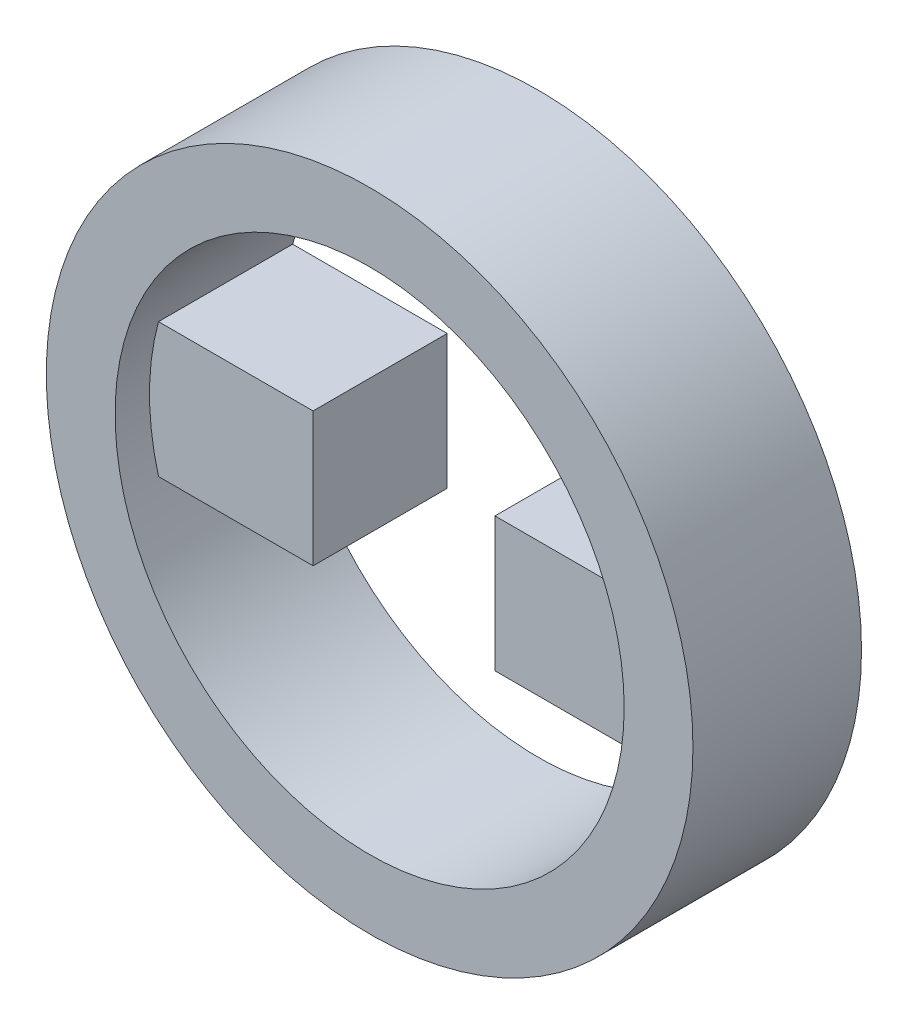
ISO-10303-21;
HEADER;
FILE_DESCRIPTION(('STEP AP214'),'2;1');
FILE_NAME('part.step','',(''),(''),'','','');
FILE_SCHEMA(('AUTOMOTIVE_DESIGN { 1 0 10303 214 1 1 1 1 }'));
ENDSEC;
DATA;
#1=APPLICATION_CONTEXT('core data for automotive mechanical design processes');
#2=APPLICATION_PROTOCOL_DEFINITION('international standard','automotive_design',2000,#1);
#3=PRODUCT_CONTEXT('',#1,'mechanical');
#4=PRODUCT('Part','Part','',(#3));
#5=PRODUCT_RELATED_PRODUCT_CATEGORY('part','',(#4));
#6=PRODUCT_DEFINITION_FORMATION('','',#4);
#7=PRODUCT_DEFINITION_CONTEXT('part definition',#1,'design');
#8=PRODUCT_DEFINITION('design','',#6,#7);
#9=PRODUCT_DEFINITION_SHAPE('','',#8);
#10=(LENGTH_UNIT() NAMED_UNIT(*) SI_UNIT(.MILLI.,.METRE.));
#11=(NAMED_UNIT(*) PLANE_ANGLE_UNIT() SI_UNIT($,.RADIAN.));
#12=(NAMED_UNIT(*) SI_UNIT($,.STERADIAN.) SOLID_ANGLE_UNIT());
#13=UNCERTAINTY_MEASURE_WITH_UNIT(LENGTH_MEASURE(1.E-05),#10,'distance_accuracy_value','');
#14=(GEOMETRIC_REPRESENTATION_CONTEXT(3) GLOBAL_UNCERTAINTY_ASSIGNED_CONTEXT((#13)) GLOBAL_UNIT_ASSIGNED_CONTEXT((#10,
#11,#12)) REPRESENTATION_CONTEXT('',''));
#15=CARTESIAN_POINT('',(0.,0.,0.));
#16=DIRECTION('',(0.,0.,1.));
#17=DIRECTION('',(1.,0.,0.));
#18=AXIS2_PLACEMENT_3D('',#15,#16,#17);
#19=CARTESIAN_POINT('',(0.,0.,4.9));
#20=DIRECTION('',(0.,0.,-1.));
#21=DIRECTION('',(-1.,0.,0.));
#22=AXIS2_PLACEMENT_3D('',#19,#20,#21);
#23=CYLINDRICAL_SURFACE('',#22,7.4);
#24=CARTESIAN_POINT('',(0.,0.,4.9));
#25=DIRECTION('',(0.,0.,1.));
#26=DIRECTION('',(1.,0.,0.));
#27=AXIS2_PLACEMENT_3D('',#24,#25,#26);
#28=CIRCLE('',#27,7.4);
#29=CARTESIAN_POINT('',(7.4,0.,4.9));
#30=VERTEX_POINT('',#29);
#31=EDGE_CURVE('E169',#30,#30,#28,.T.);
#32=ORIENTED_EDGE('',*,*,#31,.T.);
#33=EDGE_LOOP('',(#32));
#34=FACE_BOUND('',#33,.T.);
#35=CARTESIAN_POINT('',(0.,0.,0.));
#36=DIRECTION('',(0.,0.,1.));
#37=DIRECTION('',(1.,0.,0.));
#38=AXIS2_PLACEMENT_3D('',#35,#36,#37);
#39=CIRCLE('',#38,7.4);
#40=CARTESIAN_POINT('',(7.1384522131902,1.95,0.));
#41=VERTEX_POINT('',#40);
#42=CARTESIAN_POINT('',(-7.1384522131902,1.95,0.));
#43=VERTEX_POINT('',#42);
#44=EDGE_CURVE('E168',#41,#43,#39,.T.);
#45=ORIENTED_EDGE('',*,*,#44,.F.);
#46=DIRECTION('',(0.,0.,-1.));
#47=VECTOR('',#46,1.);
#48=CARTESIAN_POINT('',(7.1384522131902,1.95,4.9));
#49=LINE('',#48,#47);
#50=CARTESIAN_POINT('',(7.1384522131902,1.95,3.9));
#51=VERTEX_POINT('',#50);
#52=EDGE_CURVE('E144',#41,#51,#49,.F.);
#53=ORIENTED_EDGE('',*,*,#52,.T.);
#54=CARTESIAN_POINT('',(0.,0.,3.9));
#55=DIRECTION('',(0.,0.,-1.));
#56=DIRECTION('',(-1.,0.,0.));
#57=AXIS2_PLACEMENT_3D('',#54,#55,#56);
#58=CIRCLE('',#57,7.4);
#59=CARTESIAN_POINT('',(7.1384522131902,-1.95,3.9));
#60=VERTEX_POINT('',#59);
#61=EDGE_CURVE('E12',#51,#60,#58,.T.);
#62=ORIENTED_EDGE('',*,*,#61,.T.);
#63=DIRECTION('',(0.,0.,-1.));
#64=VECTOR('',#63,1.);
#65=CARTESIAN_POINT('',(7.1384522131902,-1.95,4.9));
#66=LINE('',#65,#64);
#67=CARTESIAN_POINT('',(7.1384522131902,-1.95,0.));
#68=VERTEX_POINT('',#67);
#69=EDGE_CURVE('E140',#60,#68,#66,.T.);
#70=ORIENTED_EDGE('',*,*,#69,.T.);
#71=CARTESIAN_POINT('',(-7.1384522131902,-1.95,0.));
#72=VERTEX_POINT('',#71);
#73=EDGE_CURVE('E132',#72,#68,#39,.T.);
#74=ORIENTED_EDGE('',*,*,#73,.F.);
#75=DIRECTION('',(0.,0.,-1.));
#76=VECTOR('',#75,1.);
#77=CARTESIAN_POINT('',(-7.1384522131902,-1.95,4.9));
#78=LINE('',#77,#76);
#79=CARTESIAN_POINT('',(-7.1384522131902,-1.95,3.9));
#80=VERTEX_POINT('',#79);
#81=EDGE_CURVE('E181',#72,#80,#78,.F.);
#82=ORIENTED_EDGE('',*,*,#81,.T.);
#83=CARTESIAN_POINT('',(0.,0.,3.9));
#84=DIRECTION('',(0.,0.,1.));
#85=DIRECTION('',(1.,0.,0.));
#86=AXIS2_PLACEMENT_3D('',#83,#84,#85);
#87=CIRCLE('',#86,7.4);
#88=CARTESIAN_POINT('',(-7.1384522131902,1.95,3.9));
#89=VERTEX_POINT('',#88);
#90=EDGE_CURVE('E177',#89,#80,#87,.T.);
#91=ORIENTED_EDGE('',*,*,#90,.F.);
#92=DIRECTION('',(0.,0.,-1.));
#93=VECTOR('',#92,1.);
#94=CARTESIAN_POINT('',(-7.1384522131902,1.95,4.9));
#95=LINE('',#94,#93);
#96=EDGE_CURVE('E55',#89,#43,#95,.T.);
#97=ORIENTED_EDGE('',*,*,#96,.T.);
#98=EDGE_LOOP('',(#45,#53,#62,#70,#74,#82,#91,#97));
#99=FACE_BOUND('',#98,.T.);
#100=ADVANCED_FACE('F47',(#34,#99),#23,.F.);
#101=CARTESIAN_POINT('',(0.,0.,4.9));
#102=DIRECTION('',(0.,0.,1.));
#103=DIRECTION('',(1.,0.,0.));
#104=AXIS2_PLACEMENT_3D('',#101,#102,#103);
#105=PLANE('',#104);
#106=CARTESIAN_POINT('',(0.,0.,4.9));
#107=DIRECTION('',(0.,0.,1.));
#108=DIRECTION('',(1.,0.,0.));
#109=AXIS2_PLACEMENT_3D('',#106,#107,#108);
#110=CIRCLE('',#109,9.4);
#111=CARTESIAN_POINT('',(9.4,0.,4.9));
#112=VERTEX_POINT('',#111);
#113=EDGE_CURVE('E174',#112,#112,#110,.T.);
#114=ORIENTED_EDGE('',*,*,#113,.T.);
#115=EDGE_LOOP('',(#114));
#116=FACE_BOUND('',#115,.T.);
#117=ORIENTED_EDGE('',*,*,#31,.F.);
#118=EDGE_LOOP('',(#117));
#119=FACE_BOUND('',#118,.T.);
#120=ADVANCED_FACE('F213',(#116,#119),#105,.T.);
#121=CARTESIAN_POINT('',(0.,0.,0.));
#122=DIRECTION('',(0.,0.,1.));
#123=DIRECTION('',(1.,0.,0.));
#124=AXIS2_PLACEMENT_3D('',#121,#122,#123);
#125=PLANE('',#124);
#126=ORIENTED_EDGE('',*,*,#73,.T.);
#127=DIRECTION('',(1.,0.,0.));
#128=VECTOR('',#127,1.);
#129=CARTESIAN_POINT('',(8.14220968810114,-1.95,0.));
#130=LINE('',#129,#128);
#131=CARTESIAN_POINT('',(2.64368483130695,-1.95,0.));
#132=VERTEX_POINT('',#131);
#133=EDGE_CURVE('E121',#132,#68,#130,.T.);
#134=ORIENTED_EDGE('',*,*,#133,.F.);
#135=DIRECTION('',(0.,-1.,0.));
#136=VECTOR('',#135,1.);
#137=CARTESIAN_POINT('',(2.64368483130695,1.95,0.));
#138=LINE('',#137,#136);
#139=CARTESIAN_POINT('',(2.64368483130695,1.95,0.));
#140=VERTEX_POINT('',#139);
#141=EDGE_CURVE('E112',#140,#132,#138,.T.);
#142=ORIENTED_EDGE('',*,*,#141,.F.);
#143=DIRECTION('',(-1.,0.,0.));
#144=VECTOR('',#143,1.);
#145=CARTESIAN_POINT('',(8.14220968810114,1.95,0.));
#146=LINE('',#145,#144);
#147=EDGE_CURVE('E62',#41,#140,#146,.T.);
#148=ORIENTED_EDGE('',*,*,#147,.F.);
#149=ORIENTED_EDGE('',*,*,#44,.T.);
#150=DIRECTION('',(-1.,0.,0.));
#151=VECTOR('',#150,1.);
#152=CARTESIAN_POINT('',(-8.14220968810114,1.95,0.));
#153=LINE('',#152,#151);
#154=CARTESIAN_POINT('',(-2.64368483130695,1.95,0.));
#155=VERTEX_POINT('',#154);
#156=EDGE_CURVE('E159',#155,#43,#153,.T.);
#157=ORIENTED_EDGE('',*,*,#156,.F.);
#158=DIRECTION('',(0.,1.,0.));
#159=VECTOR('',#158,1.);
#160=CARTESIAN_POINT('',(-2.64368483130695,1.95,0.));
#161=LINE('',#160,#159);
#162=CARTESIAN_POINT('',(-2.64368483130695,-1.95,0.));
#163=VERTEX_POINT('',#162);
#164=EDGE_CURVE('E147',#163,#155,#161,.T.);
#165=ORIENTED_EDGE('',*,*,#164,.F.);
#166=DIRECTION('',(1.,0.,0.));
#167=VECTOR('',#166,1.);
#168=CARTESIAN_POINT('',(-8.14220968810114,-1.95,0.));
#169=LINE('',#168,#167);
#170=EDGE_CURVE('E69',#72,#163,#169,.T.);
#171=ORIENTED_EDGE('',*,*,#170,.F.);
#172=EDGE_LOOP('',(#126,#134,#142,#148,#149,#157,#165,#171));
#173=FACE_BOUND('',#172,.T.);
#174=CARTESIAN_POINT('',(0.,0.,0.));
#175=DIRECTION('',(0.,0.,1.));
#176=DIRECTION('',(1.,0.,0.));
#177=AXIS2_PLACEMENT_3D('',#174,#175,#176);
#178=CIRCLE('',#177,9.4);
#179=CARTESIAN_POINT('',(9.4,0.,0.));
#180=VERTEX_POINT('',#179);
#181=EDGE_CURVE('E172',#180,#180,#178,.T.);
#182=ORIENTED_EDGE('',*,*,#181,.F.);
#183=EDGE_LOOP('',(#182));
#184=FACE_BOUND('',#183,.T.);
#185=ADVANCED_FACE('F129',(#173,#184),#125,.F.);
#186=CARTESIAN_POINT('',(0.,0.,4.9));
#187=DIRECTION('',(0.,0.,-1.));
#188=DIRECTION('',(-1.,0.,0.));
#189=AXIS2_PLACEMENT_3D('',#186,#187,#188);
#190=CYLINDRICAL_SURFACE('',#189,9.4);
#191=ORIENTED_EDGE('',*,*,#113,.F.);
#192=EDGE_LOOP('',(#191));
#193=FACE_BOUND('',#192,.T.);
#194=ORIENTED_EDGE('',*,*,#181,.T.);
#195=EDGE_LOOP('',(#194));
#196=FACE_BOUND('',#195,.T.);
#197=ADVANCED_FACE('F49',(#193,#196),#190,.T.);
#198=CARTESIAN_POINT('',(0.,0.,3.9));
#199=DIRECTION('',(0.,0.,1.));
#200=DIRECTION('',(1.,0.,0.));
#201=AXIS2_PLACEMENT_3D('',#198,#199,#200);
#202=PLANE('',#201);
#203=DIRECTION('',(-1.,0.,0.));
#204=VECTOR('',#203,1.);
#205=CARTESIAN_POINT('',(-8.14220968810114,1.95,3.9));
#206=LINE('',#205,#204);
#207=CARTESIAN_POINT('',(-2.64368483130695,1.95,3.9));
#208=VERTEX_POINT('',#207);
#209=EDGE_CURVE('E151',#208,#89,#206,.T.);
#210=ORIENTED_EDGE('',*,*,#209,.T.);
#211=ORIENTED_EDGE('',*,*,#90,.T.);
#212=DIRECTION('',(1.,0.,0.));
#213=VECTOR('',#212,1.);
#214=CARTESIAN_POINT('',(-8.14220968810114,-1.95,3.9));
#215=LINE('',#214,#213);
#216=CARTESIAN_POINT('',(-2.64368483130695,-1.95,3.9));
#217=VERTEX_POINT('',#216);
#218=EDGE_CURVE('E154',#80,#217,#215,.T.);
#219=ORIENTED_EDGE('',*,*,#218,.T.);
#220=DIRECTION('',(0.,1.,0.));
#221=VECTOR('',#220,1.);
#222=CARTESIAN_POINT('',(-2.64368483130695,1.95,3.9));
#223=LINE('',#222,#221);
#224=EDGE_CURVE('E148',#217,#208,#223,.T.);
#225=ORIENTED_EDGE('',*,*,#224,.T.);
#226=EDGE_LOOP('',(#210,#211,#219,#225));
#227=FACE_BOUND('',#226,.T.);
#228=ADVANCED_FACE('F190',(#227),#202,.T.);
#229=CARTESIAN_POINT('',(-2.64368483130695,1.95,3.9));
#230=DIRECTION('',(-1.,0.,0.));
#231=DIRECTION('',(0.,0.,1.));
#232=AXIS2_PLACEMENT_3D('',#229,#230,#231);
#233=PLANE('',#232);
#234=ORIENTED_EDGE('',*,*,#164,.T.);
#235=DIRECTION('',(0.,0.,-1.));
#236=VECTOR('',#235,1.);
#237=CARTESIAN_POINT('',(-2.64368483130695,1.95,3.9));
#238=LINE('',#237,#236);
#239=EDGE_CURVE('E165',#208,#155,#238,.T.);
#240=ORIENTED_EDGE('',*,*,#239,.F.);
#241=ORIENTED_EDGE('',*,*,#224,.F.);
#242=DIRECTION('',(0.,0.,-1.));
#243=VECTOR('',#242,1.);
#244=CARTESIAN_POINT('',(-2.64368483130695,-1.95,3.9));
#245=LINE('',#244,#243);
#246=EDGE_CURVE('E156',#217,#163,#245,.T.);
#247=ORIENTED_EDGE('',*,*,#246,.T.);
#248=EDGE_LOOP('',(#234,#240,#241,#247));
#249=FACE_BOUND('',#248,.T.);
#250=ADVANCED_FACE('F196',(#249),#233,.F.);
#251=CARTESIAN_POINT('',(-8.14220968810114,1.95,3.9));
#252=DIRECTION('',(0.,-1.,0.));
#253=DIRECTION('',(1.,0.,0.));
#254=AXIS2_PLACEMENT_3D('',#251,#252,#253);
#255=PLANE('',#254);
#256=ORIENTED_EDGE('',*,*,#96,.F.);
#257=ORIENTED_EDGE('',*,*,#209,.F.);
#258=ORIENTED_EDGE('',*,*,#239,.T.);
#259=ORIENTED_EDGE('',*,*,#156,.T.);
#260=EDGE_LOOP('',(#256,#257,#258,#259));
#261=FACE_BOUND('',#260,.T.);
#262=ADVANCED_FACE('F188',(#261),#255,.F.);
#263=CARTESIAN_POINT('',(-8.14220968810114,-1.95,3.9));
#264=DIRECTION('',(0.,1.,0.));
#265=DIRECTION('',(-1.,0.,0.));
#266=AXIS2_PLACEMENT_3D('',#263,#264,#265);
#267=PLANE('',#266);
#268=ORIENTED_EDGE('',*,*,#81,.F.);
#269=ORIENTED_EDGE('',*,*,#170,.T.);
#270=ORIENTED_EDGE('',*,*,#246,.F.);
#271=ORIENTED_EDGE('',*,*,#218,.F.);
#272=EDGE_LOOP('',(#268,#269,#270,#271));
#273=FACE_BOUND('',#272,.T.);
#274=ADVANCED_FACE('F198',(#273),#267,.F.);
#275=CARTESIAN_POINT('',(0.,0.,3.9));
#276=DIRECTION('',(0.,0.,-1.));
#277=DIRECTION('',(-1.,0.,0.));
#278=AXIS2_PLACEMENT_3D('',#275,#276,#277);
#279=PLANE('',#278);
#280=ORIENTED_EDGE('',*,*,#61,.F.);
#281=DIRECTION('',(-1.,0.,0.));
#282=VECTOR('',#281,1.);
#283=CARTESIAN_POINT('',(8.14220968810114,1.95,3.9));
#284=LINE('',#283,#282);
#285=CARTESIAN_POINT('',(2.64368483130695,1.95,3.9));
#286=VERTEX_POINT('',#285);
#287=EDGE_CURVE('E133',#51,#286,#284,.T.);
#288=ORIENTED_EDGE('',*,*,#287,.T.);
#289=DIRECTION('',(0.,-1.,0.));
#290=VECTOR('',#289,1.);
#291=CARTESIAN_POINT('',(2.64368483130695,1.95,3.9));
#292=LINE('',#291,#290);
#293=CARTESIAN_POINT('',(2.64368483130695,-1.95,3.9));
#294=VERTEX_POINT('',#293);
#295=EDGE_CURVE('E135',#286,#294,#292,.T.);
#296=ORIENTED_EDGE('',*,*,#295,.T.);
#297=DIRECTION('',(1.,0.,0.));
#298=VECTOR('',#297,1.);
#299=CARTESIAN_POINT('',(8.14220968810114,-1.95,3.9));
#300=LINE('',#299,#298);
#301=EDGE_CURVE('E127',#294,#60,#300,.T.);
#302=ORIENTED_EDGE('',*,*,#301,.T.);
#303=EDGE_LOOP('',(#280,#288,#296,#302));
#304=FACE_BOUND('',#303,.T.);
#305=ADVANCED_FACE('F200',(#304),#279,.F.);
#306=CARTESIAN_POINT('',(8.14220968810114,1.95,3.9));
#307=DIRECTION('',(0.,-1.,0.));
#308=DIRECTION('',(1.,0.,0.));
#309=AXIS2_PLACEMENT_3D('',#306,#307,#308);
#310=PLANE('',#309);
#311=ORIENTED_EDGE('',*,*,#52,.F.);
#312=ORIENTED_EDGE('',*,*,#147,.T.);
#313=DIRECTION('',(0.,0.,-1.));
#314=VECTOR('',#313,1.);
#315=CARTESIAN_POINT('',(2.64368483130695,1.95,3.9));
#316=LINE('',#315,#314);
#317=EDGE_CURVE('E119',#286,#140,#316,.T.);
#318=ORIENTED_EDGE('',*,*,#317,.F.);
#319=ORIENTED_EDGE('',*,*,#287,.F.);
#320=EDGE_LOOP('',(#311,#312,#318,#319));
#321=FACE_BOUND('',#320,.T.);
#322=ADVANCED_FACE('F203',(#321),#310,.F.);
#323=CARTESIAN_POINT('',(2.64368483130695,1.95,3.9));
#324=DIRECTION('',(1.,0.,0.));
#325=DIRECTION('',(0.,0.,-1.));
#326=AXIS2_PLACEMENT_3D('',#323,#324,#325);
#327=PLANE('',#326);
#328=ORIENTED_EDGE('',*,*,#141,.T.);
#329=DIRECTION('',(0.,0.,-1.));
#330=VECTOR('',#329,1.);
#331=CARTESIAN_POINT('',(2.64368483130695,-1.95,3.9));
#332=LINE('',#331,#330);
#333=EDGE_CURVE('E116',#294,#132,#332,.T.);
#334=ORIENTED_EDGE('',*,*,#333,.F.);
#335=ORIENTED_EDGE('',*,*,#295,.F.);
#336=ORIENTED_EDGE('',*,*,#317,.T.);
#337=EDGE_LOOP('',(#328,#334,#335,#336));
#338=FACE_BOUND('',#337,.T.);
#339=ADVANCED_FACE('F114',(#338),#327,.F.);
#340=CARTESIAN_POINT('',(8.14220968810114,-1.95,3.9));
#341=DIRECTION('',(0.,1.,0.));
#342=DIRECTION('',(-1.,0.,0.));
#343=AXIS2_PLACEMENT_3D('',#340,#341,#342);
#344=PLANE('',#343);
#345=ORIENTED_EDGE('',*,*,#69,.F.);
#346=ORIENTED_EDGE('',*,*,#301,.F.);
#347=ORIENTED_EDGE('',*,*,#333,.T.);
#348=ORIENTED_EDGE('',*,*,#133,.T.);
#349=EDGE_LOOP('',(#345,#346,#347,#348));
#350=FACE_BOUND('',#349,.T.);
#351=ADVANCED_FACE('F124',(#350),#344,.F.);
#352=CLOSED_SHELL('',(#100,#120,#185,#197,#228,#250,#262,#274,#305,#322,#339,#351));
#353=MANIFOLD_SOLID_BREP('B2',#352);
#354=ADVANCED_BREP_SHAPE_REPRESENTATION('',(#18,#353),#14);
#355=SHAPE_DEFINITION_REPRESENTATION(#9,#354);
ENDSEC;
END-ISO-10303-21;
